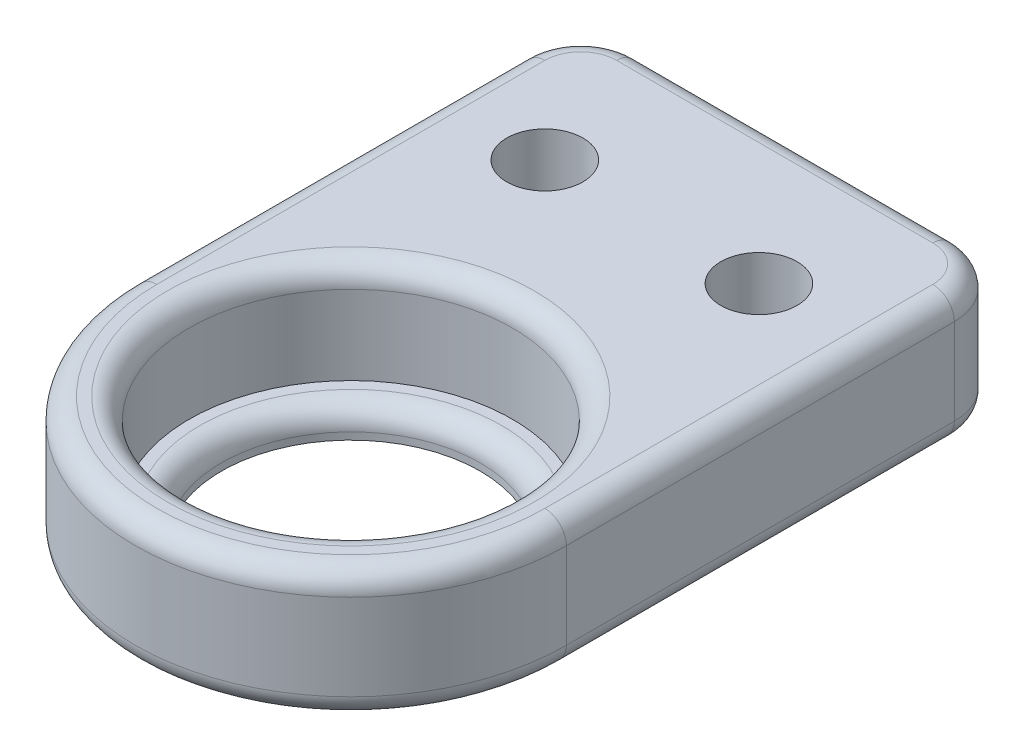
ISO-10303-21;
HEADER;
FILE_DESCRIPTION(('STEP AP214'),'2;1');
FILE_NAME('part.step','',(''),(''),'','','');
FILE_SCHEMA(('AUTOMOTIVE_DESIGN { 1 0 10303 214 1 1 1 1 }'));
ENDSEC;
DATA;
#1=APPLICATION_CONTEXT('core data for automotive mechanical design processes');
#2=APPLICATION_PROTOCOL_DEFINITION('international standard','automotive_design',2000,#1);
#3=PRODUCT_CONTEXT('',#1,'mechanical');
#4=PRODUCT('Part','Part','',(#3));
#5=PRODUCT_RELATED_PRODUCT_CATEGORY('part','',(#4));
#6=PRODUCT_DEFINITION_FORMATION('','',#4);
#7=PRODUCT_DEFINITION_CONTEXT('part definition',#1,'design');
#8=PRODUCT_DEFINITION('design','',#6,#7);
#9=PRODUCT_DEFINITION_SHAPE('','',#8);
#10=(LENGTH_UNIT() NAMED_UNIT(*) SI_UNIT(.MILLI.,.METRE.));
#11=(NAMED_UNIT(*) PLANE_ANGLE_UNIT() SI_UNIT($,.RADIAN.));
#12=(NAMED_UNIT(*) SI_UNIT($,.STERADIAN.) SOLID_ANGLE_UNIT());
#13=UNCERTAINTY_MEASURE_WITH_UNIT(LENGTH_MEASURE(1.E-05),#10,'distance_accuracy_value','');
#14=(GEOMETRIC_REPRESENTATION_CONTEXT(3) GLOBAL_UNCERTAINTY_ASSIGNED_CONTEXT((#13)) GLOBAL_UNIT_ASSIGNED_CONTEXT((#10,
#11,#12)) REPRESENTATION_CONTEXT('',''));
#15=CARTESIAN_POINT('',(0.,0.,0.));
#16=DIRECTION('',(0.,0.,1.));
#17=DIRECTION('',(1.,0.,0.));
#18=AXIS2_PLACEMENT_3D('',#15,#16,#17);
#19=CARTESIAN_POINT('',(0.,9.,0.));
#20=DIRECTION('',(0.,-1.,0.));
#21=DIRECTION('',(0.,0.,-1.));
#22=AXIS2_PLACEMENT_3D('',#19,#20,#21);
#23=CYLINDRICAL_SURFACE('',#22,15.);
#24=DIRECTION('',(0.,-1.,0.));
#25=VECTOR('',#24,1.);
#26=CARTESIAN_POINT('',(-15.,9.,0.));
#27=LINE('',#26,#25);
#28=CARTESIAN_POINT('',(-15.,7.5,0.));
#29=VERTEX_POINT('',#28);
#30=CARTESIAN_POINT('',(-15.,1.5,0.));
#31=VERTEX_POINT('',#30);
#32=EDGE_CURVE('E321',#29,#31,#27,.T.);
#33=ORIENTED_EDGE('',*,*,#32,.T.);
#34=CARTESIAN_POINT('',(0.,1.5,0.));
#35=DIRECTION('',(0.,1.,0.));
#36=DIRECTION('',(0.,0.,1.));
#37=AXIS2_PLACEMENT_3D('',#34,#35,#36);
#38=CIRCLE('',#37,15.);
#39=CARTESIAN_POINT('',(15.,1.5,0.));
#40=VERTEX_POINT('',#39);
#41=EDGE_CURVE('E194',#31,#40,#38,.T.);
#42=ORIENTED_EDGE('',*,*,#41,.T.);
#43=DIRECTION('',(0.,-1.,0.));
#44=VECTOR('',#43,1.);
#45=CARTESIAN_POINT('',(15.,9.,0.));
#46=LINE('',#45,#44);
#47=CARTESIAN_POINT('',(15.,7.5,0.));
#48=VERTEX_POINT('',#47);
#49=EDGE_CURVE('E313',#48,#40,#46,.T.);
#50=ORIENTED_EDGE('',*,*,#49,.F.);
#51=CARTESIAN_POINT('',(0.,7.5,0.));
#52=DIRECTION('',(0.,1.,0.));
#53=DIRECTION('',(0.,0.,1.));
#54=AXIS2_PLACEMENT_3D('',#51,#52,#53);
#55=CIRCLE('',#54,15.);
#56=EDGE_CURVE('E190',#48,#29,#55,.F.);
#57=ORIENTED_EDGE('',*,*,#56,.T.);
#58=EDGE_LOOP('',(#33,#42,#50,#57));
#59=FACE_BOUND('',#58,.T.);
#60=ADVANCED_FACE('F51',(#59),#23,.T.);
#61=CARTESIAN_POINT('',(15.,9.,0.));
#62=DIRECTION('',(-1.,0.,0.));
#63=DIRECTION('',(0.,0.,1.));
#64=AXIS2_PLACEMENT_3D('',#61,#62,#63);
#65=PLANE('',#64);
#66=ORIENTED_EDGE('',*,*,#49,.T.);
#67=DIRECTION('',(0.,0.,-1.));
#68=VECTOR('',#67,1.);
#69=CARTESIAN_POINT('',(15.,1.5,0.));
#70=LINE('',#69,#68);
#71=CARTESIAN_POINT('',(15.,1.5,-27.));
#72=VERTEX_POINT('',#71);
#73=EDGE_CURVE('E11',#40,#72,#70,.T.);
#74=ORIENTED_EDGE('',*,*,#73,.T.);
#75=DIRECTION('',(0.,-1.,0.));
#76=VECTOR('',#75,1.);
#77=CARTESIAN_POINT('',(15.,9.,-27.));
#78=LINE('',#77,#76);
#79=CARTESIAN_POINT('',(15.,7.5,-27.));
#80=VERTEX_POINT('',#79);
#81=EDGE_CURVE('E171',#72,#80,#78,.F.);
#82=ORIENTED_EDGE('',*,*,#81,.T.);
#83=DIRECTION('',(0.,0.,-1.));
#84=VECTOR('',#83,1.);
#85=CARTESIAN_POINT('',(15.,7.5,0.));
#86=LINE('',#85,#84);
#87=EDGE_CURVE('E61',#80,#48,#86,.F.);
#88=ORIENTED_EDGE('',*,*,#87,.T.);
#89=EDGE_LOOP('',(#66,#74,#82,#88));
#90=FACE_BOUND('',#89,.T.);
#91=ADVANCED_FACE('F312',(#90),#65,.F.);
#92=CARTESIAN_POINT('',(0.,9.,-31.));
#93=DIRECTION('',(0.,0.,-1.));
#94=DIRECTION('',(-1.,0.,0.));
#95=AXIS2_PLACEMENT_3D('',#92,#93,#94);
#96=PLANE('',#95);
#97=DIRECTION('',(0.,-1.,0.));
#98=VECTOR('',#97,1.);
#99=CARTESIAN_POINT('',(11.,0.,-31.));
#100=LINE('',#99,#98);
#101=CARTESIAN_POINT('',(11.,7.5,-31.));
#102=VERTEX_POINT('',#101);
#103=CARTESIAN_POINT('',(11.,1.5,-31.));
#104=VERTEX_POINT('',#103);
#105=EDGE_CURVE('E335',#102,#104,#100,.T.);
#106=ORIENTED_EDGE('',*,*,#105,.T.);
#107=DIRECTION('',(1.,0.,0.));
#108=VECTOR('',#107,1.);
#109=CARTESIAN_POINT('',(-11.,1.5,-31.));
#110=LINE('',#109,#108);
#111=CARTESIAN_POINT('',(-11.,1.5,-31.));
#112=VERTEX_POINT('',#111);
#113=EDGE_CURVE('E213',#104,#112,#110,.F.);
#114=ORIENTED_EDGE('',*,*,#113,.T.);
#115=DIRECTION('',(0.,-1.,0.));
#116=VECTOR('',#115,1.);
#117=CARTESIAN_POINT('',(-11.,9.,-31.));
#118=LINE('',#117,#116);
#119=CARTESIAN_POINT('',(-11.,7.5,-31.));
#120=VERTEX_POINT('',#119);
#121=EDGE_CURVE('E175',#112,#120,#118,.F.);
#122=ORIENTED_EDGE('',*,*,#121,.T.);
#123=DIRECTION('',(1.,0.,0.));
#124=VECTOR('',#123,1.);
#125=CARTESIAN_POINT('',(0.,7.5,-31.));
#126=LINE('',#125,#124);
#127=EDGE_CURVE('E210',#120,#102,#126,.T.);
#128=ORIENTED_EDGE('',*,*,#127,.T.);
#129=EDGE_LOOP('',(#106,#114,#122,#128));
#130=FACE_BOUND('',#129,.T.);
#131=ADVANCED_FACE('F342',(#130),#96,.T.);
#132=CARTESIAN_POINT('',(-15.,9.,0.));
#133=DIRECTION('',(-1.,0.,0.));
#134=DIRECTION('',(0.,0.,1.));
#135=AXIS2_PLACEMENT_3D('',#132,#133,#134);
#136=PLANE('',#135);
#137=DIRECTION('',(0.,-1.,0.));
#138=VECTOR('',#137,1.);
#139=CARTESIAN_POINT('',(-15.,9.,-27.));
#140=LINE('',#139,#138);
#141=CARTESIAN_POINT('',(-15.,7.5,-27.));
#142=VERTEX_POINT('',#141);
#143=CARTESIAN_POINT('',(-15.,1.5,-27.));
#144=VERTEX_POINT('',#143);
#145=EDGE_CURVE('E326',#142,#144,#140,.T.);
#146=ORIENTED_EDGE('',*,*,#145,.T.);
#147=DIRECTION('',(0.,0.,-1.));
#148=VECTOR('',#147,1.);
#149=CARTESIAN_POINT('',(-15.,1.5,0.));
#150=LINE('',#149,#148);
#151=EDGE_CURVE('E201',#144,#31,#150,.F.);
#152=ORIENTED_EDGE('',*,*,#151,.T.);
#153=ORIENTED_EDGE('',*,*,#32,.F.);
#154=DIRECTION('',(0.,0.,-1.));
#155=VECTOR('',#154,1.);
#156=CARTESIAN_POINT('',(-15.,7.5,0.));
#157=LINE('',#156,#155);
#158=EDGE_CURVE('E198',#29,#142,#157,.T.);
#159=ORIENTED_EDGE('',*,*,#158,.T.);
#160=EDGE_LOOP('',(#146,#152,#153,#159));
#161=FACE_BOUND('',#160,.T.);
#162=ADVANCED_FACE('F362',(#161),#136,.T.);
#163=CARTESIAN_POINT('',(0.,9.,0.));
#164=DIRECTION('',(0.,-1.,0.));
#165=DIRECTION('',(0.,0.,-1.));
#166=AXIS2_PLACEMENT_3D('',#163,#164,#165);
#167=CYLINDRICAL_SURFACE('',#166,11.25);
#168=CARTESIAN_POINT('',(0.,7.5,0.));
#169=DIRECTION('',(0.,1.,0.));
#170=DIRECTION('',(0.,0.,1.));
#171=AXIS2_PLACEMENT_3D('',#168,#169,#170);
#172=CIRCLE('',#171,11.25);
#173=CARTESIAN_POINT('',(0.,7.5,11.25));
#174=VERTEX_POINT('',#173);
#175=EDGE_CURVE('E249',#174,#174,#172,.T.);
#176=ORIENTED_EDGE('',*,*,#175,.T.);
#177=EDGE_LOOP('',(#176));
#178=FACE_BOUND('',#177,.T.);
#179=CARTESIAN_POINT('',(0.,2.,0.));
#180=DIRECTION('',(0.,1.,0.));
#181=DIRECTION('',(0.,0.,1.));
#182=AXIS2_PLACEMENT_3D('',#179,#180,#181);
#183=CIRCLE('',#182,11.25);
#184=CARTESIAN_POINT('',(0.,2.,11.25));
#185=VERTEX_POINT('',#184);
#186=EDGE_CURVE('E320',#185,#185,#183,.T.);
#187=ORIENTED_EDGE('',*,*,#186,.F.);
#188=EDGE_LOOP('',(#187));
#189=FACE_BOUND('',#188,.T.);
#190=ADVANCED_FACE('F389',(#178,#189),#167,.F.);
#191=CARTESIAN_POINT('',(0.,9.,0.));
#192=DIRECTION('',(0.,1.,0.));
#193=DIRECTION('',(0.,0.,1.));
#194=AXIS2_PLACEMENT_3D('',#191,#192,#193);
#195=PLANE('',#194);
#196=CARTESIAN_POINT('',(0.,9.,0.));
#197=DIRECTION('',(0.,1.,0.));
#198=DIRECTION('',(0.,0.,1.));
#199=AXIS2_PLACEMENT_3D('',#196,#197,#198);
#200=CIRCLE('',#199,12.75);
#201=CARTESIAN_POINT('',(0.,9.,12.75));
#202=VERTEX_POINT('',#201);
#203=EDGE_CURVE('E237',#202,#202,#200,.F.);
#204=ORIENTED_EDGE('',*,*,#203,.T.);
#205=EDGE_LOOP('',(#204));
#206=FACE_BOUND('',#205,.T.);
#207=DIRECTION('',(0.,0.,-1.));
#208=VECTOR('',#207,1.);
#209=CARTESIAN_POINT('',(-13.5,9.,0.));
#210=LINE('',#209,#208);
#211=CARTESIAN_POINT('',(-13.5,9.,-27.));
#212=VERTEX_POINT('',#211);
#213=CARTESIAN_POINT('',(-13.5,9.,0.));
#214=VERTEX_POINT('',#213);
#215=EDGE_CURVE('E69',#212,#214,#210,.F.);
#216=ORIENTED_EDGE('',*,*,#215,.T.);
#217=CARTESIAN_POINT('',(0.,9.,0.));
#218=DIRECTION('',(0.,1.,0.));
#219=DIRECTION('',(0.,0.,1.));
#220=AXIS2_PLACEMENT_3D('',#217,#218,#219);
#221=CIRCLE('',#220,13.5);
#222=CARTESIAN_POINT('',(13.5,9.,0.));
#223=VERTEX_POINT('',#222);
#224=EDGE_CURVE('E234',#214,#223,#221,.T.);
#225=ORIENTED_EDGE('',*,*,#224,.T.);
#226=DIRECTION('',(0.,0.,-1.));
#227=VECTOR('',#226,1.);
#228=CARTESIAN_POINT('',(13.5,9.,-27.));
#229=LINE('',#228,#227);
#230=CARTESIAN_POINT('',(13.5,9.,-27.));
#231=VERTEX_POINT('',#230);
#232=EDGE_CURVE('E221',#223,#231,#229,.T.);
#233=ORIENTED_EDGE('',*,*,#232,.T.);
#234=CARTESIAN_POINT('',(11.,9.,-27.));
#235=DIRECTION('',(0.,1.,0.));
#236=DIRECTION('',(0.,0.,1.));
#237=AXIS2_PLACEMENT_3D('',#234,#235,#236);
#238=CIRCLE('',#237,2.5);
#239=CARTESIAN_POINT('',(11.,9.,-29.5));
#240=VERTEX_POINT('',#239);
#241=EDGE_CURVE('E224',#231,#240,#238,.T.);
#242=ORIENTED_EDGE('',*,*,#241,.T.);
#243=DIRECTION('',(1.,0.,0.));
#244=VECTOR('',#243,1.);
#245=CARTESIAN_POINT('',(0.,9.,-29.5));
#246=LINE('',#245,#244);
#247=CARTESIAN_POINT('',(-11.,9.,-29.5));
#248=VERTEX_POINT('',#247);
#249=EDGE_CURVE('E227',#240,#248,#246,.F.);
#250=ORIENTED_EDGE('',*,*,#249,.T.);
#251=CARTESIAN_POINT('',(-11.,9.,-27.));
#252=DIRECTION('',(0.,1.,0.));
#253=DIRECTION('',(0.,0.,1.));
#254=AXIS2_PLACEMENT_3D('',#251,#252,#253);
#255=CIRCLE('',#254,2.5);
#256=EDGE_CURVE('E74',#248,#212,#255,.T.);
#257=ORIENTED_EDGE('',*,*,#256,.T.);
#258=EDGE_LOOP('',(#216,#225,#233,#242,#250,#257));
#259=FACE_BOUND('',#258,.T.);
#260=CARTESIAN_POINT('',(7.4,9.,-21.));
#261=DIRECTION('',(0.,-1.,0.));
#262=DIRECTION('',(0.,0.,-1.));
#263=AXIS2_PLACEMENT_3D('',#260,#261,#262);
#264=CIRCLE('',#263,2.65);
#265=CARTESIAN_POINT('',(7.4,9.,-23.65));
#266=VERTEX_POINT('',#265);
#267=EDGE_CURVE('E430',#266,#266,#264,.T.);
#268=ORIENTED_EDGE('',*,*,#267,.T.);
#269=EDGE_LOOP('',(#268));
#270=FACE_BOUND('',#269,.T.);
#271=CARTESIAN_POINT('',(-7.5,9.,-21.));
#272=DIRECTION('',(0.,-1.,0.));
#273=DIRECTION('',(0.,0.,-1.));
#274=AXIS2_PLACEMENT_3D('',#271,#272,#273);
#275=CIRCLE('',#274,2.65);
#276=CARTESIAN_POINT('',(-7.5,9.,-23.65));
#277=VERTEX_POINT('',#276);
#278=EDGE_CURVE('E444',#277,#277,#275,.T.);
#279=ORIENTED_EDGE('',*,*,#278,.T.);
#280=EDGE_LOOP('',(#279));
#281=FACE_BOUND('',#280,.T.);
#282=ADVANCED_FACE('F301',(#206,#259,#270,#281),#195,.T.);
#283=CARTESIAN_POINT('',(0.,0.,0.));
#284=DIRECTION('',(0.,1.,0.));
#285=DIRECTION('',(0.,0.,1.));
#286=AXIS2_PLACEMENT_3D('',#283,#284,#285);
#287=PLANE('',#286);
#288=DIRECTION('',(0.,0.,-1.));
#289=VECTOR('',#288,1.);
#290=CARTESIAN_POINT('',(13.5,0.,0.));
#291=LINE('',#290,#289);
#292=CARTESIAN_POINT('',(13.5,0.,-27.));
#293=VERTEX_POINT('',#292);
#294=CARTESIAN_POINT('',(13.5,0.,0.));
#295=VERTEX_POINT('',#294);
#296=EDGE_CURVE('E147',#293,#295,#291,.F.);
#297=ORIENTED_EDGE('',*,*,#296,.T.);
#298=CARTESIAN_POINT('',(0.,0.,0.));
#299=DIRECTION('',(0.,1.,0.));
#300=DIRECTION('',(0.,0.,1.));
#301=AXIS2_PLACEMENT_3D('',#298,#299,#300);
#302=CIRCLE('',#301,13.5);
#303=CARTESIAN_POINT('',(-13.5,0.,0.));
#304=VERTEX_POINT('',#303);
#305=EDGE_CURVE('E187',#295,#304,#302,.F.);
#306=ORIENTED_EDGE('',*,*,#305,.T.);
#307=DIRECTION('',(0.,0.,-1.));
#308=VECTOR('',#307,1.);
#309=CARTESIAN_POINT('',(-13.5,0.,-27.));
#310=LINE('',#309,#308);
#311=CARTESIAN_POINT('',(-13.5,0.,-27.));
#312=VERTEX_POINT('',#311);
#313=EDGE_CURVE('E184',#304,#312,#310,.T.);
#314=ORIENTED_EDGE('',*,*,#313,.T.);
#315=CARTESIAN_POINT('',(-11.,0.,-27.));
#316=DIRECTION('',(0.,1.,0.));
#317=DIRECTION('',(0.,0.,1.));
#318=AXIS2_PLACEMENT_3D('',#315,#316,#317);
#319=CIRCLE('',#318,2.5);
#320=CARTESIAN_POINT('',(-11.,0.,-29.5));
#321=VERTEX_POINT('',#320);
#322=EDGE_CURVE('E181',#312,#321,#319,.F.);
#323=ORIENTED_EDGE('',*,*,#322,.T.);
#324=DIRECTION('',(1.,0.,0.));
#325=VECTOR('',#324,1.);
#326=CARTESIAN_POINT('',(11.,0.,-29.5));
#327=LINE('',#326,#325);
#328=CARTESIAN_POINT('',(11.,0.,-29.5));
#329=VERTEX_POINT('',#328);
#330=EDGE_CURVE('E150',#321,#329,#327,.T.);
#331=ORIENTED_EDGE('',*,*,#330,.T.);
#332=CARTESIAN_POINT('',(11.,0.,-27.));
#333=DIRECTION('',(0.,1.,0.));
#334=DIRECTION('',(0.,0.,1.));
#335=AXIS2_PLACEMENT_3D('',#332,#333,#334);
#336=CIRCLE('',#335,2.5);
#337=EDGE_CURVE('E141',#329,#293,#336,.F.);
#338=ORIENTED_EDGE('',*,*,#337,.T.);
#339=EDGE_LOOP('',(#297,#306,#314,#323,#331,#338));
#340=FACE_BOUND('',#339,.T.);
#341=CARTESIAN_POINT('',(7.4,0.,-21.));
#342=DIRECTION('',(0.,-1.,0.));
#343=DIRECTION('',(0.,0.,-1.));
#344=AXIS2_PLACEMENT_3D('',#341,#342,#343);
#345=CIRCLE('',#344,5.6);
#346=CARTESIAN_POINT('',(7.4,0.,-26.6));
#347=VERTEX_POINT('',#346);
#348=EDGE_CURVE('E269',#347,#347,#345,.T.);
#349=ORIENTED_EDGE('',*,*,#348,.F.);
#350=EDGE_LOOP('',(#349));
#351=FACE_BOUND('',#350,.T.);
#352=CARTESIAN_POINT('',(-7.5,0.,-21.));
#353=DIRECTION('',(0.,-1.,0.));
#354=DIRECTION('',(0.,0.,-1.));
#355=AXIS2_PLACEMENT_3D('',#352,#353,#354);
#356=CIRCLE('',#355,5.6);
#357=CARTESIAN_POINT('',(-7.5,0.,-26.6));
#358=VERTEX_POINT('',#357);
#359=EDGE_CURVE('E436',#358,#358,#356,.T.);
#360=ORIENTED_EDGE('',*,*,#359,.F.);
#361=EDGE_LOOP('',(#360));
#362=FACE_BOUND('',#361,.T.);
#363=CARTESIAN_POINT('',(0.,0.,0.));
#364=DIRECTION('',(0.,1.,0.));
#365=DIRECTION('',(0.,0.,1.));
#366=AXIS2_PLACEMENT_3D('',#363,#364,#365);
#367=CIRCLE('',#366,9.);
#368=CARTESIAN_POINT('',(0.,0.,9.));
#369=VERTEX_POINT('',#368);
#370=EDGE_CURVE('E328',#369,#369,#367,.T.);
#371=ORIENTED_EDGE('',*,*,#370,.T.);
#372=EDGE_LOOP('',(#371));
#373=FACE_BOUND('',#372,.T.);
#374=ADVANCED_FACE('F143',(#340,#351,#362,#373),#287,.F.);
#375=CARTESIAN_POINT('',(0.,2.,0.));
#376=DIRECTION('',(0.,-1.,0.));
#377=DIRECTION('',(0.,0.,-1.));
#378=AXIS2_PLACEMENT_3D('',#375,#376,#377);
#379=CYLINDRICAL_SURFACE('',#378,9.);
#380=CARTESIAN_POINT('',(0.,0.5,0.));
#381=DIRECTION('',(0.,1.,0.));
#382=DIRECTION('',(0.,0.,1.));
#383=AXIS2_PLACEMENT_3D('',#380,#381,#382);
#384=CIRCLE('',#383,9.);
#385=CARTESIAN_POINT('',(0.,0.5,9.));
#386=VERTEX_POINT('',#385);
#387=EDGE_CURVE('E241',#386,#386,#384,.T.);
#388=ORIENTED_EDGE('',*,*,#387,.T.);
#389=EDGE_LOOP('',(#388));
#390=FACE_BOUND('',#389,.T.);
#391=ORIENTED_EDGE('',*,*,#370,.F.);
#392=EDGE_LOOP('',(#391));
#393=FACE_BOUND('',#392,.T.);
#394=ADVANCED_FACE('F395',(#390,#393),#379,.F.);
#395=CARTESIAN_POINT('',(0.,2.,0.));
#396=DIRECTION('',(0.,1.,0.));
#397=DIRECTION('',(0.,0.,1.));
#398=AXIS2_PLACEMENT_3D('',#395,#396,#397);
#399=PLANE('',#398);
#400=CARTESIAN_POINT('',(0.,2.,0.));
#401=DIRECTION('',(0.,1.,0.));
#402=DIRECTION('',(0.,0.,1.));
#403=AXIS2_PLACEMENT_3D('',#400,#401,#402);
#404=CIRCLE('',#403,10.5);
#405=CARTESIAN_POINT('',(0.,2.,10.5));
#406=VERTEX_POINT('',#405);
#407=EDGE_CURVE('E245',#406,#406,#404,.F.);
#408=ORIENTED_EDGE('',*,*,#407,.T.);
#409=EDGE_LOOP('',(#408));
#410=FACE_BOUND('',#409,.T.);
#411=ORIENTED_EDGE('',*,*,#186,.T.);
#412=EDGE_LOOP('',(#411));
#413=FACE_BOUND('',#412,.T.);
#414=ADVANCED_FACE('F401',(#410,#413),#399,.T.);
#415=CARTESIAN_POINT('',(-7.5,0.,-21.));
#416=DIRECTION('',(0.,-1.,0.));
#417=DIRECTION('',(0.,0.,-1.));
#418=AXIS2_PLACEMENT_3D('',#415,#416,#417);
#419=CYLINDRICAL_SURFACE('',#418,2.65);
#420=ORIENTED_EDGE('',*,*,#278,.F.);
#421=EDGE_LOOP('',(#420));
#422=FACE_BOUND('',#421,.T.);
#423=CARTESIAN_POINT('',(-7.5,2.95,-21.));
#424=DIRECTION('',(0.,-1.,0.));
#425=DIRECTION('',(0.,0.,-1.));
#426=AXIS2_PLACEMENT_3D('',#423,#424,#425);
#427=CIRCLE('',#426,2.65);
#428=CARTESIAN_POINT('',(-7.5,2.95,-23.65));
#429=VERTEX_POINT('',#428);
#430=EDGE_CURVE('E440',#429,#429,#427,.T.);
#431=ORIENTED_EDGE('',*,*,#430,.T.);
#432=EDGE_LOOP('',(#431));
#433=FACE_BOUND('',#432,.T.);
#434=ADVANCED_FACE('F405',(#422,#433),#419,.F.);
#435=CARTESIAN_POINT('',(-7.5,0.,-21.));
#436=DIRECTION('',(0.,-1.,0.));
#437=DIRECTION('',(0.,0.,-1.));
#438=AXIS2_PLACEMENT_3D('',#435,#436,#437);
#439=CONICAL_SURFACE('',#438,5.6,0.785398163397449);
#440=ORIENTED_EDGE('',*,*,#430,.F.);
#441=EDGE_LOOP('',(#440));
#442=FACE_BOUND('',#441,.T.);
#443=ORIENTED_EDGE('',*,*,#359,.T.);
#444=EDGE_LOOP('',(#443));
#445=FACE_BOUND('',#444,.T.);
#446=ADVANCED_FACE('F409',(#442,#445),#439,.F.);
#447=CARTESIAN_POINT('',(7.4,0.,-21.));
#448=DIRECTION('',(0.,-1.,0.));
#449=DIRECTION('',(0.,0.,-1.));
#450=AXIS2_PLACEMENT_3D('',#447,#448,#449);
#451=CYLINDRICAL_SURFACE('',#450,2.65);
#452=ORIENTED_EDGE('',*,*,#267,.F.);
#453=EDGE_LOOP('',(#452));
#454=FACE_BOUND('',#453,.T.);
#455=CARTESIAN_POINT('',(7.4,2.95,-21.));
#456=DIRECTION('',(0.,-1.,0.));
#457=DIRECTION('',(0.,0.,-1.));
#458=AXIS2_PLACEMENT_3D('',#455,#456,#457);
#459=CIRCLE('',#458,2.65);
#460=CARTESIAN_POINT('',(7.4,2.95,-23.65));
#461=VERTEX_POINT('',#460);
#462=EDGE_CURVE('E424',#461,#461,#459,.T.);
#463=ORIENTED_EDGE('',*,*,#462,.T.);
#464=EDGE_LOOP('',(#463));
#465=FACE_BOUND('',#464,.T.);
#466=ADVANCED_FACE('F413',(#454,#465),#451,.F.);
#467=CARTESIAN_POINT('',(7.4,0.,-21.));
#468=DIRECTION('',(0.,-1.,0.));
#469=DIRECTION('',(0.,0.,-1.));
#470=AXIS2_PLACEMENT_3D('',#467,#468,#469);
#471=CONICAL_SURFACE('',#470,5.6,0.785398163397448);
#472=ORIENTED_EDGE('',*,*,#462,.F.);
#473=EDGE_LOOP('',(#472));
#474=FACE_BOUND('',#473,.T.);
#475=ORIENTED_EDGE('',*,*,#348,.T.);
#476=EDGE_LOOP('',(#475));
#477=FACE_BOUND('',#476,.T.);
#478=ADVANCED_FACE('F374',(#474,#477),#471,.F.);
#479=CARTESIAN_POINT('',(-11.,9.,-27.));
#480=DIRECTION('',(0.,-1.,0.));
#481=DIRECTION('',(0.,0.,-1.));
#482=AXIS2_PLACEMENT_3D('',#479,#480,#481);
#483=CYLINDRICAL_SURFACE('',#482,4.);
#484=ORIENTED_EDGE('',*,*,#121,.F.);
#485=CARTESIAN_POINT('',(-11.,1.5,-27.));
#486=DIRECTION('',(0.,1.,0.));
#487=DIRECTION('',(0.,0.,1.));
#488=AXIS2_PLACEMENT_3D('',#485,#486,#487);
#489=CIRCLE('',#488,4.);
#490=EDGE_CURVE('E207',#112,#144,#489,.T.);
#491=ORIENTED_EDGE('',*,*,#490,.T.);
#492=ORIENTED_EDGE('',*,*,#145,.F.);
#493=CARTESIAN_POINT('',(-11.,7.5,-27.));
#494=DIRECTION('',(0.,1.,0.));
#495=DIRECTION('',(0.,0.,1.));
#496=AXIS2_PLACEMENT_3D('',#493,#494,#495);
#497=CIRCLE('',#496,4.);
#498=EDGE_CURVE('E204',#142,#120,#497,.F.);
#499=ORIENTED_EDGE('',*,*,#498,.T.);
#500=EDGE_LOOP('',(#484,#491,#492,#499));
#501=FACE_BOUND('',#500,.T.);
#502=ADVANCED_FACE('F347',(#501),#483,.T.);
#503=CARTESIAN_POINT('',(11.,9.,-27.));
#504=DIRECTION('',(0.,1.,0.));
#505=DIRECTION('',(0.,0.,1.));
#506=AXIS2_PLACEMENT_3D('',#503,#504,#505);
#507=CYLINDRICAL_SURFACE('',#506,4.);
#508=ORIENTED_EDGE('',*,*,#81,.F.);
#509=CARTESIAN_POINT('',(11.,1.5,-27.));
#510=DIRECTION('',(0.,1.,0.));
#511=DIRECTION('',(0.,0.,1.));
#512=AXIS2_PLACEMENT_3D('',#509,#510,#511);
#513=CIRCLE('',#512,4.);
#514=EDGE_CURVE('E160',#72,#104,#513,.T.);
#515=ORIENTED_EDGE('',*,*,#514,.T.);
#516=ORIENTED_EDGE('',*,*,#105,.F.);
#517=CARTESIAN_POINT('',(11.,7.5,-27.));
#518=DIRECTION('',(0.,1.,0.));
#519=DIRECTION('',(0.,0.,1.));
#520=AXIS2_PLACEMENT_3D('',#517,#518,#519);
#521=CIRCLE('',#520,4.);
#522=EDGE_CURVE('E216',#102,#80,#521,.F.);
#523=ORIENTED_EDGE('',*,*,#522,.T.);
#524=EDGE_LOOP('',(#508,#515,#516,#523));
#525=FACE_BOUND('',#524,.T.);
#526=ADVANCED_FACE('F366',(#525),#507,.T.);
#527=CARTESIAN_POINT('',(0.,1.5,-29.5));
#528=DIRECTION('',(-1.,0.,0.));
#529=DIRECTION('',(0.,0.,1.));
#530=AXIS2_PLACEMENT_3D('',#527,#528,#529);
#531=CYLINDRICAL_SURFACE('',#530,1.5);
#532=CARTESIAN_POINT('',(-11.,1.5,-29.5));
#533=DIRECTION('',(-1.,0.,0.));
#534=DIRECTION('',(0.,0.,1.));
#535=AXIS2_PLACEMENT_3D('',#532,#533,#534);
#536=CIRCLE('',#535,1.5);
#537=EDGE_CURVE('E164',#112,#321,#536,.T.);
#538=ORIENTED_EDGE('',*,*,#537,.F.);
#539=ORIENTED_EDGE('',*,*,#113,.F.);
#540=CARTESIAN_POINT('',(11.,1.5,-29.5));
#541=DIRECTION('',(1.,0.,0.));
#542=DIRECTION('',(0.,0.,-1.));
#543=AXIS2_PLACEMENT_3D('',#540,#541,#542);
#544=CIRCLE('',#543,1.5);
#545=EDGE_CURVE('E266',#329,#104,#544,.T.);
#546=ORIENTED_EDGE('',*,*,#545,.F.);
#547=ORIENTED_EDGE('',*,*,#330,.F.);
#548=EDGE_LOOP('',(#538,#539,#546,#547));
#549=FACE_BOUND('',#548,.T.);
#550=ADVANCED_FACE('F351',(#549),#531,.T.);
#551=CARTESIAN_POINT('',(11.,1.5,-27.));
#552=DIRECTION('',(0.,1.,0.));
#553=DIRECTION('',(0.,0.,1.));
#554=AXIS2_PLACEMENT_3D('',#551,#552,#553);
#555=TOROIDAL_SURFACE('',#554,2.5,1.5);
#556=ORIENTED_EDGE('',*,*,#545,.T.);
#557=ORIENTED_EDGE('',*,*,#514,.F.);
#558=CARTESIAN_POINT('',(13.5,1.5,-27.));
#559=DIRECTION('',(0.,0.,1.));
#560=DIRECTION('',(1.,0.,0.));
#561=AXIS2_PLACEMENT_3D('',#558,#559,#560);
#562=CIRCLE('',#561,1.5);
#563=EDGE_CURVE('E158',#293,#72,#562,.T.);
#564=ORIENTED_EDGE('',*,*,#563,.F.);
#565=ORIENTED_EDGE('',*,*,#337,.F.);
#566=EDGE_LOOP('',(#556,#557,#564,#565));
#567=FACE_BOUND('',#566,.T.);
#568=ADVANCED_FACE('F159',(#567),#555,.T.);
#569=CARTESIAN_POINT('',(-11.,1.5,-27.));
#570=DIRECTION('',(0.,1.,0.));
#571=DIRECTION('',(0.,0.,1.));
#572=AXIS2_PLACEMENT_3D('',#569,#570,#571);
#573=TOROIDAL_SURFACE('',#572,2.5,1.5);
#574=ORIENTED_EDGE('',*,*,#537,.T.);
#575=ORIENTED_EDGE('',*,*,#322,.F.);
#576=CARTESIAN_POINT('',(-13.5,1.5,-27.));
#577=DIRECTION('',(0.,0.,1.));
#578=DIRECTION('',(1.,0.,0.));
#579=AXIS2_PLACEMENT_3D('',#576,#577,#578);
#580=CIRCLE('',#579,1.5);
#581=EDGE_CURVE('E165',#144,#312,#580,.T.);
#582=ORIENTED_EDGE('',*,*,#581,.F.);
#583=ORIENTED_EDGE('',*,*,#490,.F.);
#584=EDGE_LOOP('',(#574,#575,#582,#583));
#585=FACE_BOUND('',#584,.T.);
#586=ADVANCED_FACE('F355',(#585),#573,.T.);
#587=CARTESIAN_POINT('',(13.5,1.5,0.));
#588=DIRECTION('',(0.,0.,-1.));
#589=DIRECTION('',(-1.,0.,0.));
#590=AXIS2_PLACEMENT_3D('',#587,#588,#589);
#591=CYLINDRICAL_SURFACE('',#590,1.5);
#592=ORIENTED_EDGE('',*,*,#563,.T.);
#593=ORIENTED_EDGE('',*,*,#73,.F.);
#594=CARTESIAN_POINT('',(13.5,1.5,0.));
#595=DIRECTION('',(0.,0.,1.));
#596=DIRECTION('',(1.,0.,0.));
#597=AXIS2_PLACEMENT_3D('',#594,#595,#596);
#598=CIRCLE('',#597,1.5);
#599=EDGE_CURVE('E168',#295,#40,#598,.T.);
#600=ORIENTED_EDGE('',*,*,#599,.F.);
#601=ORIENTED_EDGE('',*,*,#296,.F.);
#602=EDGE_LOOP('',(#592,#593,#600,#601));
#603=FACE_BOUND('',#602,.T.);
#604=ADVANCED_FACE('F167',(#603),#591,.T.);
#605=CARTESIAN_POINT('',(-13.5,1.5,0.));
#606=DIRECTION('',(0.,0.,1.));
#607=DIRECTION('',(1.,0.,0.));
#608=AXIS2_PLACEMENT_3D('',#605,#606,#607);
#609=CYLINDRICAL_SURFACE('',#608,1.5);
#610=ORIENTED_EDGE('',*,*,#581,.T.);
#611=ORIENTED_EDGE('',*,*,#313,.F.);
#612=CARTESIAN_POINT('',(-13.5,1.5,0.));
#613=DIRECTION('',(0.,0.,1.));
#614=DIRECTION('',(1.,0.,0.));
#615=AXIS2_PLACEMENT_3D('',#612,#613,#614);
#616=CIRCLE('',#615,1.5);
#617=EDGE_CURVE('E255',#31,#304,#616,.T.);
#618=ORIENTED_EDGE('',*,*,#617,.F.);
#619=ORIENTED_EDGE('',*,*,#151,.F.);
#620=EDGE_LOOP('',(#610,#611,#618,#619));
#621=FACE_BOUND('',#620,.T.);
#622=ADVANCED_FACE('F360',(#621),#609,.T.);
#623=CARTESIAN_POINT('',(0.,1.5,0.));
#624=DIRECTION('',(0.,1.,0.));
#625=DIRECTION('',(0.,0.,1.));
#626=AXIS2_PLACEMENT_3D('',#623,#624,#625);
#627=TOROIDAL_SURFACE('',#626,13.5,1.5);
#628=ORIENTED_EDGE('',*,*,#599,.T.);
#629=ORIENTED_EDGE('',*,*,#41,.F.);
#630=ORIENTED_EDGE('',*,*,#617,.T.);
#631=ORIENTED_EDGE('',*,*,#305,.F.);
#632=EDGE_LOOP('',(#628,#629,#630,#631));
#633=FACE_BOUND('',#632,.T.);
#634=ADVANCED_FACE('F364',(#633),#627,.T.);
#635=CARTESIAN_POINT('',(0.,7.5,-29.5));
#636=DIRECTION('',(1.,0.,0.));
#637=DIRECTION('',(0.,0.,-1.));
#638=AXIS2_PLACEMENT_3D('',#635,#636,#637);
#639=CYLINDRICAL_SURFACE('',#638,1.5);
#640=CARTESIAN_POINT('',(-11.,7.5,-29.5));
#641=DIRECTION('',(-1.,0.,0.));
#642=DIRECTION('',(0.,0.,1.));
#643=AXIS2_PLACEMENT_3D('',#640,#641,#642);
#644=CIRCLE('',#643,1.5);
#645=EDGE_CURVE('E283',#248,#120,#644,.T.);
#646=ORIENTED_EDGE('',*,*,#645,.F.);
#647=ORIENTED_EDGE('',*,*,#249,.F.);
#648=CARTESIAN_POINT('',(11.,7.5,-29.5));
#649=DIRECTION('',(1.,0.,0.));
#650=DIRECTION('',(0.,0.,-1.));
#651=AXIS2_PLACEMENT_3D('',#648,#649,#650);
#652=CIRCLE('',#651,1.5);
#653=EDGE_CURVE('E55',#102,#240,#652,.T.);
#654=ORIENTED_EDGE('',*,*,#653,.F.);
#655=ORIENTED_EDGE('',*,*,#127,.F.);
#656=EDGE_LOOP('',(#646,#647,#654,#655));
#657=FACE_BOUND('',#656,.T.);
#658=ADVANCED_FACE('F300',(#657),#639,.T.);
#659=CARTESIAN_POINT('',(11.,7.5,-27.));
#660=DIRECTION('',(0.,1.,0.));
#661=DIRECTION('',(0.,0.,1.));
#662=AXIS2_PLACEMENT_3D('',#659,#660,#661);
#663=TOROIDAL_SURFACE('',#662,2.5,1.5);
#664=ORIENTED_EDGE('',*,*,#653,.T.);
#665=ORIENTED_EDGE('',*,*,#241,.F.);
#666=CARTESIAN_POINT('',(13.5,7.5,-27.));
#667=DIRECTION('',(0.,0.,1.));
#668=DIRECTION('',(1.,0.,0.));
#669=AXIS2_PLACEMENT_3D('',#666,#667,#668);
#670=CIRCLE('',#669,1.5);
#671=EDGE_CURVE('E280',#80,#231,#670,.T.);
#672=ORIENTED_EDGE('',*,*,#671,.F.);
#673=ORIENTED_EDGE('',*,*,#522,.F.);
#674=EDGE_LOOP('',(#664,#665,#672,#673));
#675=FACE_BOUND('',#674,.T.);
#676=ADVANCED_FACE('F295',(#675),#663,.T.);
#677=CARTESIAN_POINT('',(-11.,7.5,-27.));
#678=DIRECTION('',(0.,1.,0.));
#679=DIRECTION('',(0.,0.,1.));
#680=AXIS2_PLACEMENT_3D('',#677,#678,#679);
#681=TOROIDAL_SURFACE('',#680,2.5,1.5);
#682=ORIENTED_EDGE('',*,*,#645,.T.);
#683=ORIENTED_EDGE('',*,*,#498,.F.);
#684=CARTESIAN_POINT('',(-13.5,7.5,-27.));
#685=DIRECTION('',(0.,0.,1.));
#686=DIRECTION('',(1.,0.,0.));
#687=AXIS2_PLACEMENT_3D('',#684,#685,#686);
#688=CIRCLE('',#687,1.5);
#689=EDGE_CURVE('E276',#212,#142,#688,.T.);
#690=ORIENTED_EDGE('',*,*,#689,.F.);
#691=ORIENTED_EDGE('',*,*,#256,.F.);
#692=EDGE_LOOP('',(#682,#683,#690,#691));
#693=FACE_BOUND('',#692,.T.);
#694=ADVANCED_FACE('F561',(#693),#681,.T.);
#695=CARTESIAN_POINT('',(13.5,7.5,0.));
#696=DIRECTION('',(0.,0.,1.));
#697=DIRECTION('',(1.,0.,0.));
#698=AXIS2_PLACEMENT_3D('',#695,#696,#697);
#699=CYLINDRICAL_SURFACE('',#698,1.5);
#700=ORIENTED_EDGE('',*,*,#671,.T.);
#701=ORIENTED_EDGE('',*,*,#232,.F.);
#702=CARTESIAN_POINT('',(13.5,7.5,0.));
#703=DIRECTION('',(0.,0.,1.));
#704=DIRECTION('',(1.,0.,0.));
#705=AXIS2_PLACEMENT_3D('',#702,#703,#704);
#706=CIRCLE('',#705,1.5);
#707=EDGE_CURVE('E273',#48,#223,#706,.T.);
#708=ORIENTED_EDGE('',*,*,#707,.F.);
#709=ORIENTED_EDGE('',*,*,#87,.F.);
#710=EDGE_LOOP('',(#700,#701,#708,#709));
#711=FACE_BOUND('',#710,.T.);
#712=ADVANCED_FACE('F306',(#711),#699,.T.);
#713=CARTESIAN_POINT('',(-13.5,7.5,0.));
#714=DIRECTION('',(0.,0.,-1.));
#715=DIRECTION('',(-1.,0.,0.));
#716=AXIS2_PLACEMENT_3D('',#713,#714,#715);
#717=CYLINDRICAL_SURFACE('',#716,1.5);
#718=ORIENTED_EDGE('',*,*,#689,.T.);
#719=ORIENTED_EDGE('',*,*,#158,.F.);
#720=CARTESIAN_POINT('',(-13.5,7.5,0.));
#721=DIRECTION('',(0.,0.,1.));
#722=DIRECTION('',(1.,0.,0.));
#723=AXIS2_PLACEMENT_3D('',#720,#721,#722);
#724=CIRCLE('',#723,1.5);
#725=EDGE_CURVE('E270',#214,#29,#724,.T.);
#726=ORIENTED_EDGE('',*,*,#725,.F.);
#727=ORIENTED_EDGE('',*,*,#215,.F.);
#728=EDGE_LOOP('',(#718,#719,#726,#727));
#729=FACE_BOUND('',#728,.T.);
#730=ADVANCED_FACE('F580',(#729),#717,.T.);
#731=CARTESIAN_POINT('',(0.,7.5,0.));
#732=DIRECTION('',(0.,1.,0.));
#733=DIRECTION('',(0.,0.,1.));
#734=AXIS2_PLACEMENT_3D('',#731,#732,#733);
#735=TOROIDAL_SURFACE('',#734,13.5,1.5);
#736=ORIENTED_EDGE('',*,*,#707,.T.);
#737=ORIENTED_EDGE('',*,*,#224,.F.);
#738=ORIENTED_EDGE('',*,*,#725,.T.);
#739=ORIENTED_EDGE('',*,*,#56,.F.);
#740=EDGE_LOOP('',(#736,#737,#738,#739));
#741=FACE_BOUND('',#740,.T.);
#742=ADVANCED_FACE('F589',(#741),#735,.T.);
#743=CARTESIAN_POINT('',(0.,0.5,0.));
#744=DIRECTION('',(0.,1.,0.));
#745=DIRECTION('',(0.,0.,1.));
#746=AXIS2_PLACEMENT_3D('',#743,#744,#745);
#747=TOROIDAL_SURFACE('',#746,10.5,1.5);
#748=ORIENTED_EDGE('',*,*,#407,.F.);
#749=EDGE_LOOP('',(#748));
#750=FACE_BOUND('',#749,.T.);
#751=ORIENTED_EDGE('',*,*,#387,.F.);
#752=EDGE_LOOP('',(#751));
#753=FACE_BOUND('',#752,.T.);
#754=ADVANCED_FACE('F599',(#750,#753),#747,.T.);
#755=CARTESIAN_POINT('',(0.,7.5,0.));
#756=DIRECTION('',(0.,1.,0.));
#757=DIRECTION('',(0.,0.,1.));
#758=AXIS2_PLACEMENT_3D('',#755,#756,#757);
#759=TOROIDAL_SURFACE('',#758,12.75,1.5);
#760=ORIENTED_EDGE('',*,*,#203,.F.);
#761=EDGE_LOOP('',(#760));
#762=FACE_BOUND('',#761,.T.);
#763=ORIENTED_EDGE('',*,*,#175,.F.);
#764=EDGE_LOOP('',(#763));
#765=FACE_BOUND('',#764,.T.);
#766=ADVANCED_FACE('F53',(#762,#765),#759,.T.);
#767=CLOSED_SHELL('',(#60,#91,#131,#162,#190,#282,#374,#394,#414,#434,#446,#466,#478,#502,#526,
#550,#568,#586,#604,#622,#634,#658,#676,#694,#712,#730,#742,#754,#766));
#768=MANIFOLD_SOLID_BREP('B2',#767);
#769=ADVANCED_BREP_SHAPE_REPRESENTATION('',(#18,#768),#14);
#770=SHAPE_DEFINITION_REPRESENTATION(#9,#769);
ENDSEC;
END-ISO-10303-21;
